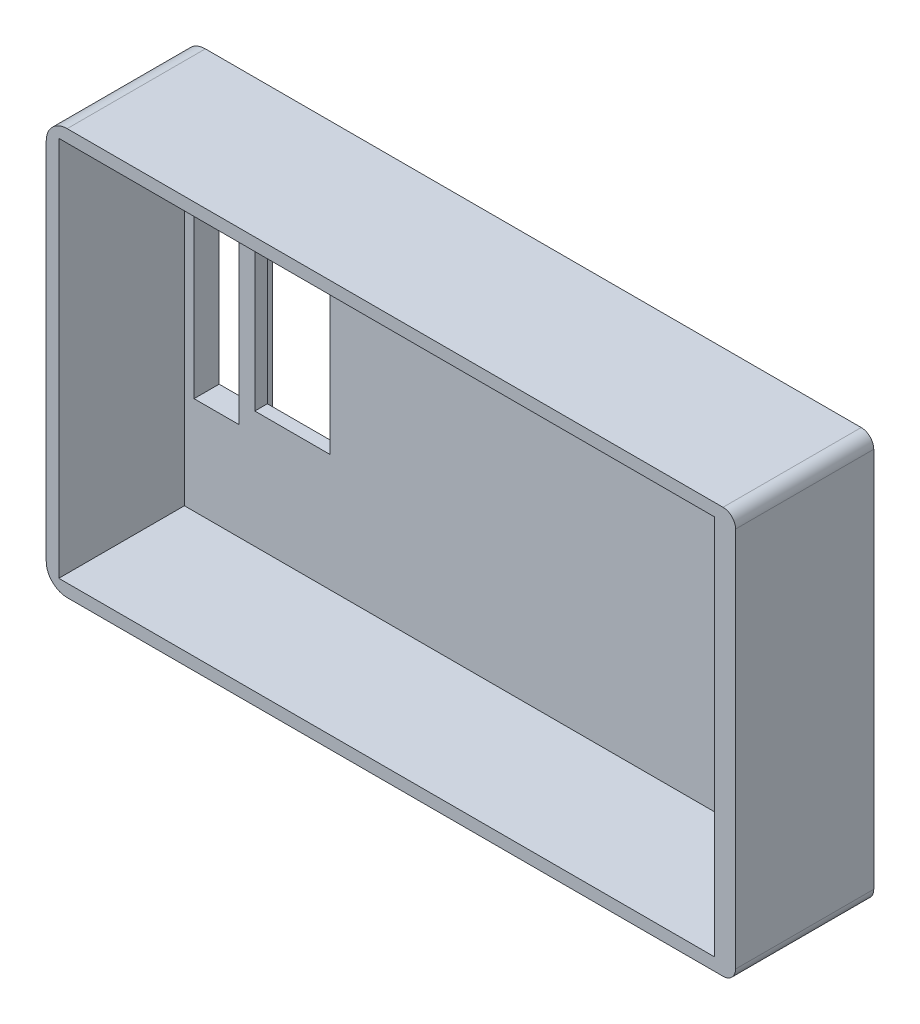
ISO-10303-21;
HEADER;
FILE_DESCRIPTION(('STEP AP214'),'2;1');
FILE_NAME('part.step','',(''),(''),'','','');
FILE_SCHEMA(('AUTOMOTIVE_DESIGN { 1 0 10303 214 1 1 1 1 }'));
ENDSEC;
DATA;
#1=APPLICATION_CONTEXT('core data for automotive mechanical design processes');
#2=APPLICATION_PROTOCOL_DEFINITION('international standard','automotive_design',2000,#1);
#3=PRODUCT_CONTEXT('',#1,'mechanical');
#4=PRODUCT('Part','Part','',(#3));
#5=PRODUCT_RELATED_PRODUCT_CATEGORY('part','',(#4));
#6=PRODUCT_DEFINITION_FORMATION('','',#4);
#7=PRODUCT_DEFINITION_CONTEXT('part definition',#1,'design');
#8=PRODUCT_DEFINITION('design','',#6,#7);
#9=PRODUCT_DEFINITION_SHAPE('','',#8);
#10=(LENGTH_UNIT() NAMED_UNIT(*) SI_UNIT(.MILLI.,.METRE.));
#11=(NAMED_UNIT(*) PLANE_ANGLE_UNIT() SI_UNIT($,.RADIAN.));
#12=(NAMED_UNIT(*) SI_UNIT($,.STERADIAN.) SOLID_ANGLE_UNIT());
#13=UNCERTAINTY_MEASURE_WITH_UNIT(LENGTH_MEASURE(1.E-05),#10,'distance_accuracy_value','');
#14=(GEOMETRIC_REPRESENTATION_CONTEXT(3) GLOBAL_UNCERTAINTY_ASSIGNED_CONTEXT((#13)) GLOBAL_UNIT_ASSIGNED_CONTEXT((#10,
#11,#12)) REPRESENTATION_CONTEXT('',''));
#15=CARTESIAN_POINT('',(0.,0.,0.));
#16=DIRECTION('',(0.,0.,1.));
#17=DIRECTION('',(1.,0.,0.));
#18=AXIS2_PLACEMENT_3D('',#15,#16,#17);
#19=CARTESIAN_POINT('',(0.,0.,3.));
#20=DIRECTION('',(0.,0.,1.));
#21=DIRECTION('',(1.,0.,0.));
#22=AXIS2_PLACEMENT_3D('',#19,#20,#21);
#23=PLANE('',#22);
#24=DIRECTION('',(-1.,0.,0.));
#25=VECTOR('',#24,1.);
#26=CARTESIAN_POINT('',(-55.8,70.7,3.));
#27=LINE('',#26,#25);
#28=CARTESIAN_POINT('',(-55.8,70.7,3.));
#29=VERTEX_POINT('',#28);
#30=CARTESIAN_POINT('',(-66.5142757664545,70.7,3.));
#31=VERTEX_POINT('',#30);
#32=EDGE_CURVE('E276',#29,#31,#27,.T.);
#33=ORIENTED_EDGE('',*,*,#32,.F.);
#34=DIRECTION('',(0.,1.,0.));
#35=VECTOR('',#34,1.);
#36=CARTESIAN_POINT('',(-55.8,26.3,3.));
#37=LINE('',#36,#35);
#38=CARTESIAN_POINT('',(-55.8,26.3,3.));
#39=VERTEX_POINT('',#38);
#40=EDGE_CURVE('E273',#39,#29,#37,.T.);
#41=ORIENTED_EDGE('',*,*,#40,.F.);
#42=DIRECTION('',(1.,0.,0.));
#43=VECTOR('',#42,1.);
#44=CARTESIAN_POINT('',(-55.8,26.3,3.));
#45=LINE('',#44,#43);
#46=CARTESIAN_POINT('',(-66.5142757664545,26.3,3.));
#47=VERTEX_POINT('',#46);
#48=EDGE_CURVE('E282',#47,#39,#45,.T.);
#49=ORIENTED_EDGE('',*,*,#48,.F.);
#50=DIRECTION('',(0.,-1.,0.));
#51=VECTOR('',#50,1.);
#52=CARTESIAN_POINT('',(-66.5142757664545,26.3,3.));
#53=LINE('',#52,#51);
#54=EDGE_CURVE('E279',#31,#47,#53,.T.);
#55=ORIENTED_EDGE('',*,*,#54,.F.);
#56=EDGE_LOOP('',(#33,#41,#49,#55));
#57=FACE_BOUND('',#56,.T.);
#58=DIRECTION('',(1.,0.,0.));
#59=VECTOR('',#58,1.);
#60=CARTESIAN_POINT('',(-52.,31.,3.));
#61=LINE('',#60,#59);
#62=CARTESIAN_POINT('',(-52.,31.,3.));
#63=VERTEX_POINT('',#62);
#64=CARTESIAN_POINT('',(-34.0355361729425,31.,3.));
#65=VERTEX_POINT('',#64);
#66=EDGE_CURVE('E288',#63,#65,#61,.T.);
#67=ORIENTED_EDGE('',*,*,#66,.F.);
#68=DIRECTION('',(0.,-1.,0.));
#69=VECTOR('',#68,1.);
#70=CARTESIAN_POINT('',(-52.,31.,3.));
#71=LINE('',#70,#69);
#72=CARTESIAN_POINT('',(-52.,66.,3.));
#73=VERTEX_POINT('',#72);
#74=EDGE_CURVE('E286',#73,#63,#71,.T.);
#75=ORIENTED_EDGE('',*,*,#74,.F.);
#76=DIRECTION('',(-1.,0.,0.));
#77=VECTOR('',#76,1.);
#78=CARTESIAN_POINT('',(-52.,66.,3.));
#79=LINE('',#78,#77);
#80=CARTESIAN_POINT('',(-34.0355361729425,66.,3.));
#81=VERTEX_POINT('',#80);
#82=EDGE_CURVE('E294',#81,#73,#79,.T.);
#83=ORIENTED_EDGE('',*,*,#82,.F.);
#84=DIRECTION('',(0.,1.,0.));
#85=VECTOR('',#84,1.);
#86=CARTESIAN_POINT('',(-34.0355361729425,31.,3.));
#87=LINE('',#86,#85);
#88=EDGE_CURVE('E291',#65,#81,#87,.T.);
#89=ORIENTED_EDGE('',*,*,#88,.F.);
#90=EDGE_LOOP('',(#67,#75,#83,#89));
#91=FACE_BOUND('',#90,.T.);
#92=DIRECTION('',(1.,0.,0.));
#93=VECTOR('',#92,1.);
#94=CARTESIAN_POINT('',(68.8142757664546,3.,3.));
#95=LINE('',#94,#93);
#96=CARTESIAN_POINT('',(-68.8142757664545,2.99999999999998,3.));
#97=VERTEX_POINT('',#96);
#98=CARTESIAN_POINT('',(87.8142757664545,3.,3.));
#99=VERTEX_POINT('',#98);
#100=EDGE_CURVE('E247',#97,#99,#95,.T.);
#101=ORIENTED_EDGE('',*,*,#100,.T.);
#102=DIRECTION('',(0.,-1.,0.));
#103=VECTOR('',#102,1.);
#104=CARTESIAN_POINT('',(87.8142757664545,3.,3.));
#105=LINE('',#104,#103);
#106=CARTESIAN_POINT('',(87.8142757664545,94.,3.));
#107=VERTEX_POINT('',#106);
#108=EDGE_CURVE('E232',#107,#99,#105,.T.);
#109=ORIENTED_EDGE('',*,*,#108,.F.);
#110=DIRECTION('',(-1.,0.,0.));
#111=VECTOR('',#110,1.);
#112=CARTESIAN_POINT('',(68.8142757664546,94.,3.));
#113=LINE('',#112,#111);
#114=CARTESIAN_POINT('',(-68.8142757664545,94.,3.));
#115=VERTEX_POINT('',#114);
#116=EDGE_CURVE('E240',#107,#115,#113,.T.);
#117=ORIENTED_EDGE('',*,*,#116,.T.);
#118=DIRECTION('',(0.,-1.,0.));
#119=VECTOR('',#118,1.);
#120=CARTESIAN_POINT('',(-68.8142757664545,2.99999999999998,3.));
#121=LINE('',#120,#119);
#122=EDGE_CURVE('E252',#115,#97,#121,.T.);
#123=ORIENTED_EDGE('',*,*,#122,.T.);
#124=EDGE_LOOP('',(#101,#109,#117,#123));
#125=FACE_BOUND('',#124,.T.);
#126=ADVANCED_FACE('F36',(#57,#91,#125),#23,.T.);
#127=CARTESIAN_POINT('',(68.8142757664546,94.,33.));
#128=DIRECTION('',(0.,-1.,0.));
#129=DIRECTION('',(1.,0.,0.));
#130=AXIS2_PLACEMENT_3D('',#127,#128,#129);
#131=PLANE('',#130);
#132=ORIENTED_EDGE('',*,*,#116,.F.);
#133=DIRECTION('',(0.,0.,-1.));
#134=VECTOR('',#133,1.);
#135=CARTESIAN_POINT('',(87.8142757664545,94.,33.));
#136=LINE('',#135,#134);
#137=CARTESIAN_POINT('',(87.8142757664545,94.,33.));
#138=VERTEX_POINT('',#137);
#139=EDGE_CURVE('E224',#138,#107,#136,.T.);
#140=ORIENTED_EDGE('',*,*,#139,.F.);
#141=DIRECTION('',(-1.,0.,0.));
#142=VECTOR('',#141,1.);
#143=CARTESIAN_POINT('',(68.8142757664546,94.,33.));
#144=LINE('',#143,#142);
#145=CARTESIAN_POINT('',(-68.8142757664545,94.,33.));
#146=VERTEX_POINT('',#145);
#147=EDGE_CURVE('E238',#138,#146,#144,.T.);
#148=ORIENTED_EDGE('',*,*,#147,.T.);
#149=DIRECTION('',(0.,0.,-1.));
#150=VECTOR('',#149,1.);
#151=CARTESIAN_POINT('',(-68.8142757664545,94.,33.));
#152=LINE('',#151,#150);
#153=EDGE_CURVE('E264',#146,#115,#152,.T.);
#154=ORIENTED_EDGE('',*,*,#153,.T.);
#155=EDGE_LOOP('',(#132,#140,#148,#154));
#156=FACE_BOUND('',#155,.T.);
#157=ADVANCED_FACE('F236',(#156),#131,.T.);
#158=CARTESIAN_POINT('',(68.8142757664546,3.,33.));
#159=DIRECTION('',(0.,1.,0.));
#160=DIRECTION('',(-1.,0.,0.));
#161=AXIS2_PLACEMENT_3D('',#158,#159,#160);
#162=PLANE('',#161);
#163=DIRECTION('',(1.,0.,0.));
#164=VECTOR('',#163,1.);
#165=CARTESIAN_POINT('',(68.8142757664546,3.,33.));
#166=LINE('',#165,#164);
#167=CARTESIAN_POINT('',(-68.8142757664545,2.99999999999998,33.));
#168=VERTEX_POINT('',#167);
#169=CARTESIAN_POINT('',(87.8142757664545,3.,33.));
#170=VERTEX_POINT('',#169);
#171=EDGE_CURVE('E249',#168,#170,#166,.T.);
#172=ORIENTED_EDGE('',*,*,#171,.T.);
#173=DIRECTION('',(0.,0.,-1.));
#174=VECTOR('',#173,1.);
#175=CARTESIAN_POINT('',(87.8142757664545,3.,33.));
#176=LINE('',#175,#174);
#177=EDGE_CURVE('E227',#170,#99,#176,.T.);
#178=ORIENTED_EDGE('',*,*,#177,.T.);
#179=ORIENTED_EDGE('',*,*,#100,.F.);
#180=DIRECTION('',(0.,0.,-1.));
#181=VECTOR('',#180,1.);
#182=CARTESIAN_POINT('',(-68.8142757664545,2.99999999999998,33.));
#183=LINE('',#182,#181);
#184=EDGE_CURVE('E259',#168,#97,#183,.T.);
#185=ORIENTED_EDGE('',*,*,#184,.F.);
#186=EDGE_LOOP('',(#172,#178,#179,#185));
#187=FACE_BOUND('',#186,.T.);
#188=ADVANCED_FACE('F484',(#187),#162,.T.);
#189=CARTESIAN_POINT('',(0.,0.,0.));
#190=DIRECTION('',(0.,0.,1.));
#191=DIRECTION('',(1.,0.,0.));
#192=AXIS2_PLACEMENT_3D('',#189,#190,#191);
#193=PLANE('',#192);
#194=DIRECTION('',(0.,-1.,0.));
#195=VECTOR('',#194,1.);
#196=CARTESIAN_POINT('',(-52.,31.,0.));
#197=LINE('',#196,#195);
#198=CARTESIAN_POINT('',(-52.,66.,0.));
#199=VERTEX_POINT('',#198);
#200=CARTESIAN_POINT('',(-52.,31.,0.));
#201=VERTEX_POINT('',#200);
#202=EDGE_CURVE('E285',#199,#201,#197,.T.);
#203=ORIENTED_EDGE('',*,*,#202,.T.);
#204=DIRECTION('',(1.,0.,0.));
#205=VECTOR('',#204,1.);
#206=CARTESIAN_POINT('',(-52.,31.,0.));
#207=LINE('',#206,#205);
#208=CARTESIAN_POINT('',(-34.0355361729425,31.,0.));
#209=VERTEX_POINT('',#208);
#210=EDGE_CURVE('E299',#201,#209,#207,.T.);
#211=ORIENTED_EDGE('',*,*,#210,.T.);
#212=DIRECTION('',(0.,1.,0.));
#213=VECTOR('',#212,1.);
#214=CARTESIAN_POINT('',(-34.0355361729425,31.,0.));
#215=LINE('',#214,#213);
#216=CARTESIAN_POINT('',(-34.0355361729425,66.,0.));
#217=VERTEX_POINT('',#216);
#218=EDGE_CURVE('E302',#209,#217,#215,.T.);
#219=ORIENTED_EDGE('',*,*,#218,.T.);
#220=DIRECTION('',(-1.,0.,0.));
#221=VECTOR('',#220,1.);
#222=CARTESIAN_POINT('',(-52.,66.,0.));
#223=LINE('',#222,#221);
#224=EDGE_CURVE('E289',#217,#199,#223,.T.);
#225=ORIENTED_EDGE('',*,*,#224,.T.);
#226=EDGE_LOOP('',(#203,#211,#219,#225));
#227=FACE_BOUND('',#226,.T.);
#228=CARTESIAN_POINT('',(-54.8,71.7,0.));
#229=DIRECTION('',(0.,0.,1.));
#230=DIRECTION('',(1.,0.,0.));
#231=AXIS2_PLACEMENT_3D('',#228,#229,#230);
#232=CIRCLE('',#231,0.999999999999994);
#233=CARTESIAN_POINT('',(-54.8,72.7,0.));
#234=VERTEX_POINT('',#233);
#235=CARTESIAN_POINT('',(-53.8,71.7,0.));
#236=VERTEX_POINT('',#235);
#237=EDGE_CURVE('E323',#234,#236,#232,.F.);
#238=ORIENTED_EDGE('',*,*,#237,.F.);
#239=DIRECTION('',(1.,0.,0.));
#240=VECTOR('',#239,1.);
#241=CARTESIAN_POINT('',(0.,72.7,0.));
#242=LINE('',#241,#240);
#243=CARTESIAN_POINT('',(-67.5142757664545,72.7,0.));
#244=VERTEX_POINT('',#243);
#245=EDGE_CURVE('E358',#244,#234,#242,.T.);
#246=ORIENTED_EDGE('',*,*,#245,.F.);
#247=CARTESIAN_POINT('',(-67.5142757664545,71.7,0.));
#248=DIRECTION('',(0.,0.,1.));
#249=DIRECTION('',(1.,0.,0.));
#250=AXIS2_PLACEMENT_3D('',#247,#248,#249);
#251=CIRCLE('',#250,1.);
#252=CARTESIAN_POINT('',(-68.5142757664546,71.7,0.));
#253=VERTEX_POINT('',#252);
#254=EDGE_CURVE('E360',#244,#253,#251,.T.);
#255=ORIENTED_EDGE('',*,*,#254,.T.);
#256=DIRECTION('',(0.,1.,0.));
#257=VECTOR('',#256,1.);
#258=CARTESIAN_POINT('',(-68.5142757664545,0.,0.));
#259=LINE('',#258,#257);
#260=CARTESIAN_POINT('',(-68.5142757664545,25.3,0.));
#261=VERTEX_POINT('',#260);
#262=EDGE_CURVE('E363',#261,#253,#259,.T.);
#263=ORIENTED_EDGE('',*,*,#262,.F.);
#264=CARTESIAN_POINT('',(-67.5142757664545,25.3,0.));
#265=DIRECTION('',(0.,0.,1.));
#266=DIRECTION('',(1.,0.,0.));
#267=AXIS2_PLACEMENT_3D('',#264,#265,#266);
#268=CIRCLE('',#267,1.);
#269=CARTESIAN_POINT('',(-67.5142757664545,24.3,0.));
#270=VERTEX_POINT('',#269);
#271=EDGE_CURVE('E366',#261,#270,#268,.T.);
#272=ORIENTED_EDGE('',*,*,#271,.T.);
#273=DIRECTION('',(1.,0.,0.));
#274=VECTOR('',#273,1.);
#275=CARTESIAN_POINT('',(0.,24.3,0.));
#276=LINE('',#275,#274);
#277=CARTESIAN_POINT('',(-54.8,24.3,0.));
#278=VERTEX_POINT('',#277);
#279=EDGE_CURVE('E369',#270,#278,#276,.T.);
#280=ORIENTED_EDGE('',*,*,#279,.T.);
#281=CARTESIAN_POINT('',(-54.8,25.3,0.));
#282=DIRECTION('',(0.,0.,1.));
#283=DIRECTION('',(1.,0.,0.));
#284=AXIS2_PLACEMENT_3D('',#281,#282,#283);
#285=CIRCLE('',#284,0.999999999999997);
#286=CARTESIAN_POINT('',(-53.8,25.3,0.));
#287=VERTEX_POINT('',#286);
#288=EDGE_CURVE('E372',#287,#278,#285,.F.);
#289=ORIENTED_EDGE('',*,*,#288,.F.);
#290=DIRECTION('',(0.,1.,0.));
#291=VECTOR('',#290,1.);
#292=CARTESIAN_POINT('',(-53.8,0.,0.));
#293=LINE('',#292,#291);
#294=EDGE_CURVE('E327',#287,#236,#293,.T.);
#295=ORIENTED_EDGE('',*,*,#294,.T.);
#296=EDGE_LOOP('',(#238,#246,#255,#263,#272,#280,#289,#295));
#297=FACE_BOUND('',#296,.T.);
#298=DIRECTION('',(0.,1.,0.));
#299=VECTOR('',#298,1.);
#300=CARTESIAN_POINT('',(92.8142757664546,0.,0.));
#301=LINE('',#300,#299);
#302=CARTESIAN_POINT('',(92.8142757664546,2.99999999999999,0.));
#303=VERTEX_POINT('',#302);
#304=CARTESIAN_POINT('',(92.8142757664546,94.,0.));
#305=VERTEX_POINT('',#304);
#306=EDGE_CURVE('E255',#303,#305,#301,.T.);
#307=ORIENTED_EDGE('',*,*,#306,.F.);
#308=CARTESIAN_POINT('',(89.8142757664546,2.99999999999999,0.));
#309=DIRECTION('',(0.,0.,1.));
#310=DIRECTION('',(1.,0.,0.));
#311=AXIS2_PLACEMENT_3D('',#308,#309,#310);
#312=CIRCLE('',#311,3.);
#313=CARTESIAN_POINT('',(89.8142757664546,0.,0.));
#314=VERTEX_POINT('',#313);
#315=EDGE_CURVE('E430',#303,#314,#312,.F.);
#316=ORIENTED_EDGE('',*,*,#315,.T.);
#317=DIRECTION('',(1.,0.,0.));
#318=VECTOR('',#317,1.);
#319=CARTESIAN_POINT('',(71.8142757664546,0.,0.));
#320=LINE('',#319,#318);
#321=CARTESIAN_POINT('',(-66.8142757664545,0.,0.));
#322=VERTEX_POINT('',#321);
#323=EDGE_CURVE('E321',#322,#314,#320,.T.);
#324=ORIENTED_EDGE('',*,*,#323,.F.);
#325=CARTESIAN_POINT('',(-66.8142757664545,4.99999999999999,0.));
#326=DIRECTION('',(0.,0.,1.));
#327=DIRECTION('',(1.,0.,0.));
#328=AXIS2_PLACEMENT_3D('',#325,#326,#327);
#329=CIRCLE('',#328,5.);
#330=CARTESIAN_POINT('',(-71.8142757664545,4.99999999999999,0.));
#331=VERTEX_POINT('',#330);
#332=EDGE_CURVE('E405',#322,#331,#329,.F.);
#333=ORIENTED_EDGE('',*,*,#332,.T.);
#334=DIRECTION('',(0.,-1.,0.));
#335=VECTOR('',#334,1.);
#336=CARTESIAN_POINT('',(-71.8142757664545,0.,0.));
#337=LINE('',#336,#335);
#338=CARTESIAN_POINT('',(-71.8142757664545,92.,0.));
#339=VERTEX_POINT('',#338);
#340=EDGE_CURVE('E318',#339,#331,#337,.T.);
#341=ORIENTED_EDGE('',*,*,#340,.F.);
#342=CARTESIAN_POINT('',(-66.8142757664545,92.,0.));
#343=DIRECTION('',(0.,0.,1.));
#344=DIRECTION('',(1.,0.,0.));
#345=AXIS2_PLACEMENT_3D('',#342,#343,#344);
#346=CIRCLE('',#345,5.);
#347=CARTESIAN_POINT('',(-66.8142757664545,97.,0.));
#348=VERTEX_POINT('',#347);
#349=EDGE_CURVE('E379',#339,#348,#346,.F.);
#350=ORIENTED_EDGE('',*,*,#349,.T.);
#351=DIRECTION('',(-1.,0.,0.));
#352=VECTOR('',#351,1.);
#353=CARTESIAN_POINT('',(71.8142757664546,97.,0.));
#354=LINE('',#353,#352);
#355=CARTESIAN_POINT('',(89.8142757664546,97.,0.));
#356=VERTEX_POINT('',#355);
#357=EDGE_CURVE('E316',#356,#348,#354,.T.);
#358=ORIENTED_EDGE('',*,*,#357,.F.);
#359=CARTESIAN_POINT('',(89.8142757664546,94.,0.));
#360=DIRECTION('',(0.,0.,1.));
#361=DIRECTION('',(1.,0.,0.));
#362=AXIS2_PLACEMENT_3D('',#359,#360,#361);
#363=CIRCLE('',#362,3.);
#364=EDGE_CURVE('E428',#356,#305,#363,.F.);
#365=ORIENTED_EDGE('',*,*,#364,.T.);
#366=EDGE_LOOP('',(#307,#316,#324,#333,#341,#350,#358,#365));
#367=FACE_BOUND('',#366,.T.);
#368=ADVANCED_FACE('F445',(#227,#297,#367),#193,.F.);
#369=CARTESIAN_POINT('',(0.,0.,33.));
#370=DIRECTION('',(0.,0.,1.));
#371=DIRECTION('',(1.,0.,0.));
#372=AXIS2_PLACEMENT_3D('',#369,#370,#371);
#373=PLANE('',#372);
#374=ORIENTED_EDGE('',*,*,#147,.F.);
#375=DIRECTION('',(0.,-1.,0.));
#376=VECTOR('',#375,1.);
#377=CARTESIAN_POINT('',(87.8142757664545,3.,33.));
#378=LINE('',#377,#376);
#379=EDGE_CURVE('E221',#138,#170,#378,.T.);
#380=ORIENTED_EDGE('',*,*,#379,.T.);
#381=ORIENTED_EDGE('',*,*,#171,.F.);
#382=DIRECTION('',(0.,-1.,0.));
#383=VECTOR('',#382,1.);
#384=CARTESIAN_POINT('',(-68.8142757664545,2.99999999999998,33.));
#385=LINE('',#384,#383);
#386=EDGE_CURVE('E246',#146,#168,#385,.T.);
#387=ORIENTED_EDGE('',*,*,#386,.F.);
#388=EDGE_LOOP('',(#374,#380,#381,#387));
#389=FACE_BOUND('',#388,.T.);
#390=DIRECTION('',(1.,0.,0.));
#391=VECTOR('',#390,1.);
#392=CARTESIAN_POINT('',(71.8142757664546,0.,33.));
#393=LINE('',#392,#391);
#394=CARTESIAN_POINT('',(-66.8142757664545,0.,33.));
#395=VERTEX_POINT('',#394);
#396=CARTESIAN_POINT('',(89.8142757664546,0.,33.));
#397=VERTEX_POINT('',#396);
#398=EDGE_CURVE('E271',#395,#397,#393,.T.);
#399=ORIENTED_EDGE('',*,*,#398,.T.);
#400=CARTESIAN_POINT('',(89.8142757664546,2.99999999999999,33.));
#401=DIRECTION('',(0.,0.,1.));
#402=DIRECTION('',(1.,0.,0.));
#403=AXIS2_PLACEMENT_3D('',#400,#401,#402);
#404=CIRCLE('',#403,3.);
#405=CARTESIAN_POINT('',(92.8142757664546,2.99999999999999,33.));
#406=VERTEX_POINT('',#405);
#407=EDGE_CURVE('E44',#397,#406,#404,.T.);
#408=ORIENTED_EDGE('',*,*,#407,.T.);
#409=DIRECTION('',(0.,-1.,0.));
#410=VECTOR('',#409,1.);
#411=CARTESIAN_POINT('',(92.8142757664546,3.,33.));
#412=LINE('',#411,#410);
#413=CARTESIAN_POINT('',(92.8142757664546,94.,33.));
#414=VERTEX_POINT('',#413);
#415=EDGE_CURVE('E241',#414,#406,#412,.T.);
#416=ORIENTED_EDGE('',*,*,#415,.F.);
#417=CARTESIAN_POINT('',(89.8142757664546,94.,33.));
#418=DIRECTION('',(0.,0.,1.));
#419=DIRECTION('',(1.,0.,0.));
#420=AXIS2_PLACEMENT_3D('',#417,#418,#419);
#421=CIRCLE('',#420,3.);
#422=CARTESIAN_POINT('',(89.8142757664546,97.,33.));
#423=VERTEX_POINT('',#422);
#424=EDGE_CURVE('E51',#414,#423,#421,.T.);
#425=ORIENTED_EDGE('',*,*,#424,.T.);
#426=DIRECTION('',(-1.,0.,0.));
#427=VECTOR('',#426,1.);
#428=CARTESIAN_POINT('',(71.8142757664546,97.,33.));
#429=LINE('',#428,#427);
#430=CARTESIAN_POINT('',(-66.8142757664545,97.,33.));
#431=VERTEX_POINT('',#430);
#432=EDGE_CURVE('E266',#423,#431,#429,.T.);
#433=ORIENTED_EDGE('',*,*,#432,.T.);
#434=CARTESIAN_POINT('',(-66.8142757664545,92.,33.));
#435=DIRECTION('',(0.,0.,1.));
#436=DIRECTION('',(1.,0.,0.));
#437=AXIS2_PLACEMENT_3D('',#434,#435,#436);
#438=CIRCLE('',#437,5.);
#439=CARTESIAN_POINT('',(-71.8142757664545,92.,33.));
#440=VERTEX_POINT('',#439);
#441=EDGE_CURVE('E410',#431,#440,#438,.T.);
#442=ORIENTED_EDGE('',*,*,#441,.T.);
#443=DIRECTION('',(0.,-1.,0.));
#444=VECTOR('',#443,1.);
#445=CARTESIAN_POINT('',(-71.8142757664545,0.,33.));
#446=LINE('',#445,#444);
#447=CARTESIAN_POINT('',(-71.8142757664545,4.99999999999999,33.));
#448=VERTEX_POINT('',#447);
#449=EDGE_CURVE('E268',#440,#448,#446,.T.);
#450=ORIENTED_EDGE('',*,*,#449,.T.);
#451=CARTESIAN_POINT('',(-66.8142757664545,4.99999999999999,33.));
#452=DIRECTION('',(0.,0.,1.));
#453=DIRECTION('',(1.,0.,0.));
#454=AXIS2_PLACEMENT_3D('',#451,#452,#453);
#455=CIRCLE('',#454,5.);
#456=EDGE_CURVE('E412',#448,#395,#455,.T.);
#457=ORIENTED_EDGE('',*,*,#456,.T.);
#458=EDGE_LOOP('',(#399,#408,#416,#425,#433,#442,#450,#457));
#459=FACE_BOUND('',#458,.T.);
#460=ADVANCED_FACE('F244',(#389,#459),#373,.T.);
#461=CARTESIAN_POINT('',(-66.5142757664545,0.,-3.));
#462=DIRECTION('',(-1.,0.,0.));
#463=DIRECTION('',(0.,-1.,0.));
#464=AXIS2_PLACEMENT_3D('',#461,#462,#463);
#465=PLANE('',#464);
#466=DIRECTION('',(0.,0.,1.));
#467=VECTOR('',#466,1.);
#468=CARTESIAN_POINT('',(-66.5142757664545,70.7,-3.));
#469=LINE('',#468,#467);
#470=CARTESIAN_POINT('',(-66.5142757664545,70.7,-3.));
#471=VERTEX_POINT('',#470);
#472=EDGE_CURVE('E384',#471,#31,#469,.T.);
#473=ORIENTED_EDGE('',*,*,#472,.T.);
#474=ORIENTED_EDGE('',*,*,#54,.T.);
#475=DIRECTION('',(0.,0.,1.));
#476=VECTOR('',#475,1.);
#477=CARTESIAN_POINT('',(-66.5142757664545,26.3,-3.));
#478=LINE('',#477,#476);
#479=CARTESIAN_POINT('',(-66.5142757664545,26.3,-3.));
#480=VERTEX_POINT('',#479);
#481=EDGE_CURVE('E377',#480,#47,#478,.T.);
#482=ORIENTED_EDGE('',*,*,#481,.F.);
#483=DIRECTION('',(0.,-1.,0.));
#484=VECTOR('',#483,1.);
#485=CARTESIAN_POINT('',(-66.5142757664545,0.,-3.));
#486=LINE('',#485,#484);
#487=EDGE_CURVE('E345',#471,#480,#486,.T.);
#488=ORIENTED_EDGE('',*,*,#487,.F.);
#489=EDGE_LOOP('',(#473,#474,#482,#488));
#490=FACE_BOUND('',#489,.T.);
#491=ADVANCED_FACE('F539',(#490),#465,.F.);
#492=CARTESIAN_POINT('',(0.,26.3,-3.));
#493=DIRECTION('',(0.,-1.,0.));
#494=DIRECTION('',(0.,0.,-1.));
#495=AXIS2_PLACEMENT_3D('',#492,#493,#494);
#496=PLANE('',#495);
#497=ORIENTED_EDGE('',*,*,#481,.T.);
#498=ORIENTED_EDGE('',*,*,#48,.T.);
#499=DIRECTION('',(0.,0.,1.));
#500=VECTOR('',#499,1.);
#501=CARTESIAN_POINT('',(-55.8,26.3,-3.));
#502=LINE('',#501,#500);
#503=CARTESIAN_POINT('',(-55.8,26.3,-3.));
#504=VERTEX_POINT('',#503);
#505=EDGE_CURVE('E380',#504,#39,#502,.T.);
#506=ORIENTED_EDGE('',*,*,#505,.F.);
#507=DIRECTION('',(1.,0.,0.));
#508=VECTOR('',#507,1.);
#509=CARTESIAN_POINT('',(0.,26.3,-3.));
#510=LINE('',#509,#508);
#511=EDGE_CURVE('E354',#480,#504,#510,.T.);
#512=ORIENTED_EDGE('',*,*,#511,.F.);
#513=EDGE_LOOP('',(#497,#498,#506,#512));
#514=FACE_BOUND('',#513,.T.);
#515=ADVANCED_FACE('F692',(#514),#496,.F.);
#516=CARTESIAN_POINT('',(-55.8,0.,-3.));
#517=DIRECTION('',(-1.,0.,0.));
#518=DIRECTION('',(0.,-1.,0.));
#519=AXIS2_PLACEMENT_3D('',#516,#517,#518);
#520=PLANE('',#519);
#521=ORIENTED_EDGE('',*,*,#505,.T.);
#522=ORIENTED_EDGE('',*,*,#40,.T.);
#523=DIRECTION('',(0.,0.,1.));
#524=VECTOR('',#523,1.);
#525=CARTESIAN_POINT('',(-55.8,70.7,-3.));
#526=LINE('',#525,#524);
#527=CARTESIAN_POINT('',(-55.8,70.7,-3.));
#528=VERTEX_POINT('',#527);
#529=EDGE_CURVE('E382',#528,#29,#526,.T.);
#530=ORIENTED_EDGE('',*,*,#529,.F.);
#531=DIRECTION('',(0.,-1.,0.));
#532=VECTOR('',#531,1.);
#533=CARTESIAN_POINT('',(-55.8,0.,-3.));
#534=LINE('',#533,#532);
#535=EDGE_CURVE('E351',#528,#504,#534,.T.);
#536=ORIENTED_EDGE('',*,*,#535,.T.);
#537=EDGE_LOOP('',(#521,#522,#530,#536));
#538=FACE_BOUND('',#537,.T.);
#539=ADVANCED_FACE('F662',(#538),#520,.T.);
#540=CARTESIAN_POINT('',(-54.8,71.7,-3.));
#541=DIRECTION('',(0.,0.,1.));
#542=DIRECTION('',(1.,0.,0.));
#543=AXIS2_PLACEMENT_3D('',#540,#541,#542);
#544=CYLINDRICAL_SURFACE('',#543,0.999999999999994);
#545=ORIENTED_EDGE('',*,*,#237,.T.);
#546=DIRECTION('',(0.,0.,1.));
#547=VECTOR('',#546,1.);
#548=CARTESIAN_POINT('',(-53.8,71.7,-3.));
#549=LINE('',#548,#547);
#550=CARTESIAN_POINT('',(-53.8,71.7,-3.));
#551=VERTEX_POINT('',#550);
#552=EDGE_CURVE('E386',#551,#236,#549,.T.);
#553=ORIENTED_EDGE('',*,*,#552,.F.);
#554=CARTESIAN_POINT('',(-54.8,71.7,-3.));
#555=DIRECTION('',(0.,0.,1.));
#556=DIRECTION('',(1.,0.,0.));
#557=AXIS2_PLACEMENT_3D('',#554,#555,#556);
#558=CIRCLE('',#557,0.999999999999994);
#559=CARTESIAN_POINT('',(-54.8,72.7,-3.));
#560=VERTEX_POINT('',#559);
#561=EDGE_CURVE('E324',#560,#551,#558,.F.);
#562=ORIENTED_EDGE('',*,*,#561,.F.);
#563=DIRECTION('',(0.,0.,1.));
#564=VECTOR('',#563,1.);
#565=CARTESIAN_POINT('',(-54.8,72.7,-3.));
#566=LINE('',#565,#564);
#567=EDGE_CURVE('E356',#560,#234,#566,.T.);
#568=ORIENTED_EDGE('',*,*,#567,.T.);
#569=EDGE_LOOP('',(#545,#553,#562,#568));
#570=FACE_BOUND('',#569,.T.);
#571=ADVANCED_FACE('F658',(#570),#544,.T.);
#572=CARTESIAN_POINT('',(-53.8,0.,-3.));
#573=DIRECTION('',(1.,0.,0.));
#574=DIRECTION('',(0.,0.,-1.));
#575=AXIS2_PLACEMENT_3D('',#572,#573,#574);
#576=PLANE('',#575);
#577=ORIENTED_EDGE('',*,*,#294,.F.);
#578=DIRECTION('',(0.,0.,1.));
#579=VECTOR('',#578,1.);
#580=CARTESIAN_POINT('',(-53.8,25.3,-3.));
#581=LINE('',#580,#579);
#582=CARTESIAN_POINT('',(-53.8,25.3,-3.));
#583=VERTEX_POINT('',#582);
#584=EDGE_CURVE('E389',#583,#287,#581,.T.);
#585=ORIENTED_EDGE('',*,*,#584,.F.);
#586=DIRECTION('',(0.,1.,0.));
#587=VECTOR('',#586,1.);
#588=CARTESIAN_POINT('',(-53.8,0.,-3.));
#589=LINE('',#588,#587);
#590=EDGE_CURVE('E342',#583,#551,#589,.T.);
#591=ORIENTED_EDGE('',*,*,#590,.T.);
#592=ORIENTED_EDGE('',*,*,#552,.T.);
#593=EDGE_LOOP('',(#577,#585,#591,#592));
#594=FACE_BOUND('',#593,.T.);
#595=ADVANCED_FACE('F661',(#594),#576,.T.);
#596=CARTESIAN_POINT('',(-54.8,25.3,-3.));
#597=DIRECTION('',(0.,0.,1.));
#598=DIRECTION('',(1.,0.,0.));
#599=AXIS2_PLACEMENT_3D('',#596,#597,#598);
#600=CYLINDRICAL_SURFACE('',#599,0.999999999999997);
#601=ORIENTED_EDGE('',*,*,#288,.T.);
#602=DIRECTION('',(0.,0.,1.));
#603=VECTOR('',#602,1.);
#604=CARTESIAN_POINT('',(-54.8,24.3,-3.));
#605=LINE('',#604,#603);
#606=CARTESIAN_POINT('',(-54.8,24.3,-3.));
#607=VERTEX_POINT('',#606);
#608=EDGE_CURVE('E391',#607,#278,#605,.T.);
#609=ORIENTED_EDGE('',*,*,#608,.F.);
#610=CARTESIAN_POINT('',(-54.8,25.3,-3.));
#611=DIRECTION('',(0.,0.,1.));
#612=DIRECTION('',(1.,0.,0.));
#613=AXIS2_PLACEMENT_3D('',#610,#611,#612);
#614=CIRCLE('',#613,0.999999999999997);
#615=EDGE_CURVE('E340',#583,#607,#614,.F.);
#616=ORIENTED_EDGE('',*,*,#615,.F.);
#617=ORIENTED_EDGE('',*,*,#584,.T.);
#618=EDGE_LOOP('',(#601,#609,#616,#617));
#619=FACE_BOUND('',#618,.T.);
#620=ADVANCED_FACE('F683',(#619),#600,.T.);
#621=CARTESIAN_POINT('',(0.,24.3,-3.));
#622=DIRECTION('',(0.,-1.,0.));
#623=DIRECTION('',(0.,0.,-1.));
#624=AXIS2_PLACEMENT_3D('',#621,#622,#623);
#625=PLANE('',#624);
#626=ORIENTED_EDGE('',*,*,#279,.F.);
#627=DIRECTION('',(0.,0.,1.));
#628=VECTOR('',#627,1.);
#629=CARTESIAN_POINT('',(-67.5142757664545,24.3,-3.));
#630=LINE('',#629,#628);
#631=CARTESIAN_POINT('',(-67.5142757664545,24.3,-3.));
#632=VERTEX_POINT('',#631);
#633=EDGE_CURVE('E393',#632,#270,#630,.T.);
#634=ORIENTED_EDGE('',*,*,#633,.F.);
#635=DIRECTION('',(1.,0.,0.));
#636=VECTOR('',#635,1.);
#637=CARTESIAN_POINT('',(0.,24.3,-3.));
#638=LINE('',#637,#636);
#639=EDGE_CURVE('E337',#632,#607,#638,.T.);
#640=ORIENTED_EDGE('',*,*,#639,.T.);
#641=ORIENTED_EDGE('',*,*,#608,.T.);
#642=EDGE_LOOP('',(#626,#634,#640,#641));
#643=FACE_BOUND('',#642,.T.);
#644=ADVANCED_FACE('F679',(#643),#625,.T.);
#645=CARTESIAN_POINT('',(-67.5142757664545,25.3,-3.));
#646=DIRECTION('',(0.,0.,1.));
#647=DIRECTION('',(1.,0.,0.));
#648=AXIS2_PLACEMENT_3D('',#645,#646,#647);
#649=CYLINDRICAL_SURFACE('',#648,1.);
#650=ORIENTED_EDGE('',*,*,#271,.F.);
#651=DIRECTION('',(0.,0.,1.));
#652=VECTOR('',#651,1.);
#653=CARTESIAN_POINT('',(-68.5142757664545,25.3,-3.));
#654=LINE('',#653,#652);
#655=CARTESIAN_POINT('',(-68.5142757664545,25.3,-3.));
#656=VERTEX_POINT('',#655);
#657=EDGE_CURVE('E395',#656,#261,#654,.T.);
#658=ORIENTED_EDGE('',*,*,#657,.F.);
#659=CARTESIAN_POINT('',(-67.5142757664545,25.3,-3.));
#660=DIRECTION('',(0.,0.,1.));
#661=DIRECTION('',(1.,0.,0.));
#662=AXIS2_PLACEMENT_3D('',#659,#660,#661);
#663=CIRCLE('',#662,1.);
#664=EDGE_CURVE('E334',#656,#632,#663,.T.);
#665=ORIENTED_EDGE('',*,*,#664,.T.);
#666=ORIENTED_EDGE('',*,*,#633,.T.);
#667=EDGE_LOOP('',(#650,#658,#665,#666));
#668=FACE_BOUND('',#667,.T.);
#669=ADVANCED_FACE('F675',(#668),#649,.T.);
#670=CARTESIAN_POINT('',(-68.5142757664545,0.,-3.));
#671=DIRECTION('',(1.,0.,0.));
#672=DIRECTION('',(0.,1.,0.));
#673=AXIS2_PLACEMENT_3D('',#670,#671,#672);
#674=PLANE('',#673);
#675=ORIENTED_EDGE('',*,*,#262,.T.);
#676=DIRECTION('',(0.,0.,1.));
#677=VECTOR('',#676,1.);
#678=CARTESIAN_POINT('',(-68.5142757664546,71.7,-3.));
#679=LINE('',#678,#677);
#680=CARTESIAN_POINT('',(-68.5142757664546,71.7,-3.));
#681=VERTEX_POINT('',#680);
#682=EDGE_CURVE('E397',#681,#253,#679,.T.);
#683=ORIENTED_EDGE('',*,*,#682,.F.);
#684=DIRECTION('',(0.,1.,0.));
#685=VECTOR('',#684,1.);
#686=CARTESIAN_POINT('',(-68.5142757664545,0.,-3.));
#687=LINE('',#686,#685);
#688=EDGE_CURVE('E332',#656,#681,#687,.T.);
#689=ORIENTED_EDGE('',*,*,#688,.F.);
#690=ORIENTED_EDGE('',*,*,#657,.T.);
#691=EDGE_LOOP('',(#675,#683,#689,#690));
#692=FACE_BOUND('',#691,.T.);
#693=ADVANCED_FACE('F671',(#692),#674,.F.);
#694=CARTESIAN_POINT('',(-67.5142757664545,71.7,-3.));
#695=DIRECTION('',(0.,0.,1.));
#696=DIRECTION('',(1.,0.,0.));
#697=AXIS2_PLACEMENT_3D('',#694,#695,#696);
#698=CYLINDRICAL_SURFACE('',#697,1.);
#699=ORIENTED_EDGE('',*,*,#254,.F.);
#700=DIRECTION('',(0.,0.,1.));
#701=VECTOR('',#700,1.);
#702=CARTESIAN_POINT('',(-67.5142757664545,72.7,-3.));
#703=LINE('',#702,#701);
#704=CARTESIAN_POINT('',(-67.5142757664545,72.7,-3.));
#705=VERTEX_POINT('',#704);
#706=EDGE_CURVE('E399',#705,#244,#703,.T.);
#707=ORIENTED_EDGE('',*,*,#706,.F.);
#708=CARTESIAN_POINT('',(-67.5142757664545,71.7,-3.));
#709=DIRECTION('',(0.,0.,1.));
#710=DIRECTION('',(1.,0.,0.));
#711=AXIS2_PLACEMENT_3D('',#708,#709,#710);
#712=CIRCLE('',#711,1.);
#713=EDGE_CURVE('E329',#705,#681,#712,.T.);
#714=ORIENTED_EDGE('',*,*,#713,.T.);
#715=ORIENTED_EDGE('',*,*,#682,.T.);
#716=EDGE_LOOP('',(#699,#707,#714,#715));
#717=FACE_BOUND('',#716,.T.);
#718=ADVANCED_FACE('F667',(#717),#698,.T.);
#719=CARTESIAN_POINT('',(0.,72.7,-3.));
#720=DIRECTION('',(0.,-1.,0.));
#721=DIRECTION('',(0.,0.,-1.));
#722=AXIS2_PLACEMENT_3D('',#719,#720,#721);
#723=PLANE('',#722);
#724=ORIENTED_EDGE('',*,*,#245,.T.);
#725=ORIENTED_EDGE('',*,*,#567,.F.);
#726=DIRECTION('',(1.,0.,0.));
#727=VECTOR('',#726,1.);
#728=CARTESIAN_POINT('',(0.,72.7,-3.));
#729=LINE('',#728,#727);
#730=EDGE_CURVE('E326',#705,#560,#729,.T.);
#731=ORIENTED_EDGE('',*,*,#730,.F.);
#732=ORIENTED_EDGE('',*,*,#706,.T.);
#733=EDGE_LOOP('',(#724,#725,#731,#732));
#734=FACE_BOUND('',#733,.T.);
#735=ADVANCED_FACE('F664',(#734),#723,.F.);
#736=CARTESIAN_POINT('',(0.,70.7,-3.));
#737=DIRECTION('',(0.,-1.,0.));
#738=DIRECTION('',(0.,0.,-1.));
#739=AXIS2_PLACEMENT_3D('',#736,#737,#738);
#740=PLANE('',#739);
#741=ORIENTED_EDGE('',*,*,#529,.T.);
#742=ORIENTED_EDGE('',*,*,#32,.T.);
#743=ORIENTED_EDGE('',*,*,#472,.F.);
#744=DIRECTION('',(1.,0.,0.));
#745=VECTOR('',#744,1.);
#746=CARTESIAN_POINT('',(0.,70.7,-3.));
#747=LINE('',#746,#745);
#748=EDGE_CURVE('E348',#471,#528,#747,.T.);
#749=ORIENTED_EDGE('',*,*,#748,.T.);
#750=EDGE_LOOP('',(#741,#742,#743,#749));
#751=FACE_BOUND('',#750,.T.);
#752=ADVANCED_FACE('F475',(#751),#740,.T.);
#753=CARTESIAN_POINT('',(0.,0.,-3.));
#754=DIRECTION('',(0.,0.,1.));
#755=DIRECTION('',(1.,0.,0.));
#756=AXIS2_PLACEMENT_3D('',#753,#754,#755);
#757=PLANE('',#756);
#758=ORIENTED_EDGE('',*,*,#561,.T.);
#759=ORIENTED_EDGE('',*,*,#590,.F.);
#760=ORIENTED_EDGE('',*,*,#615,.T.);
#761=ORIENTED_EDGE('',*,*,#639,.F.);
#762=ORIENTED_EDGE('',*,*,#664,.F.);
#763=ORIENTED_EDGE('',*,*,#688,.T.);
#764=ORIENTED_EDGE('',*,*,#713,.F.);
#765=ORIENTED_EDGE('',*,*,#730,.T.);
#766=EDGE_LOOP('',(#758,#759,#760,#761,#762,#763,#764,#765));
#767=FACE_BOUND('',#766,.T.);
#768=ORIENTED_EDGE('',*,*,#487,.T.);
#769=ORIENTED_EDGE('',*,*,#511,.T.);
#770=ORIENTED_EDGE('',*,*,#535,.F.);
#771=ORIENTED_EDGE('',*,*,#748,.F.);
#772=EDGE_LOOP('',(#768,#769,#770,#771));
#773=FACE_BOUND('',#772,.T.);
#774=ADVANCED_FACE('F468',(#767,#773),#757,.F.);
#775=CARTESIAN_POINT('',(71.8142757664546,97.,3.));
#776=DIRECTION('',(0.,-1.,0.));
#777=DIRECTION('',(0.,0.,-1.));
#778=AXIS2_PLACEMENT_3D('',#775,#776,#777);
#779=PLANE('',#778);
#780=ORIENTED_EDGE('',*,*,#432,.F.);
#781=DIRECTION('',(0.,0.,1.));
#782=VECTOR('',#781,1.);
#783=CARTESIAN_POINT('',(89.8142757664546,97.,0.));
#784=LINE('',#783,#782);
#785=EDGE_CURVE('E11',#423,#356,#784,.F.);
#786=ORIENTED_EDGE('',*,*,#785,.T.);
#787=ORIENTED_EDGE('',*,*,#357,.T.);
#788=DIRECTION('',(0.,0.,-1.));
#789=VECTOR('',#788,1.);
#790=CARTESIAN_POINT('',(-66.8142757664545,97.,3.));
#791=LINE('',#790,#789);
#792=EDGE_CURVE('E419',#348,#431,#791,.F.);
#793=ORIENTED_EDGE('',*,*,#792,.T.);
#794=EDGE_LOOP('',(#780,#786,#787,#793));
#795=FACE_BOUND('',#794,.T.);
#796=ADVANCED_FACE('F466',(#795),#779,.F.);
#797=CARTESIAN_POINT('',(-71.8142757664545,0.,3.));
#798=DIRECTION('',(1.,0.,0.));
#799=DIRECTION('',(0.,0.,-1.));
#800=AXIS2_PLACEMENT_3D('',#797,#798,#799);
#801=PLANE('',#800);
#802=ORIENTED_EDGE('',*,*,#340,.T.);
#803=DIRECTION('',(0.,0.,-1.));
#804=VECTOR('',#803,1.);
#805=CARTESIAN_POINT('',(-71.8142757664545,4.99999999999999,3.));
#806=LINE('',#805,#804);
#807=EDGE_CURVE('E417',#331,#448,#806,.F.);
#808=ORIENTED_EDGE('',*,*,#807,.T.);
#809=ORIENTED_EDGE('',*,*,#449,.F.);
#810=DIRECTION('',(0.,0.,-1.));
#811=VECTOR('',#810,1.);
#812=CARTESIAN_POINT('',(-71.8142757664545,92.,3.));
#813=LINE('',#812,#811);
#814=EDGE_CURVE('E414',#440,#339,#813,.T.);
#815=ORIENTED_EDGE('',*,*,#814,.T.);
#816=EDGE_LOOP('',(#802,#808,#809,#815));
#817=FACE_BOUND('',#816,.T.);
#818=ADVANCED_FACE('F454',(#817),#801,.F.);
#819=CARTESIAN_POINT('',(71.8142757664546,0.,3.));
#820=DIRECTION('',(0.,1.,0.));
#821=DIRECTION('',(0.,0.,1.));
#822=AXIS2_PLACEMENT_3D('',#819,#820,#821);
#823=PLANE('',#822);
#824=ORIENTED_EDGE('',*,*,#323,.T.);
#825=DIRECTION('',(0.,0.,-1.));
#826=VECTOR('',#825,1.);
#827=CARTESIAN_POINT('',(89.8142757664546,0.,33.));
#828=LINE('',#827,#826);
#829=EDGE_CURVE('E59',#314,#397,#828,.F.);
#830=ORIENTED_EDGE('',*,*,#829,.T.);
#831=ORIENTED_EDGE('',*,*,#398,.F.);
#832=DIRECTION('',(0.,0.,-1.));
#833=VECTOR('',#832,1.);
#834=CARTESIAN_POINT('',(-66.8142757664545,0.,3.));
#835=LINE('',#834,#833);
#836=EDGE_CURVE('E407',#395,#322,#835,.T.);
#837=ORIENTED_EDGE('',*,*,#836,.T.);
#838=EDGE_LOOP('',(#824,#830,#831,#837));
#839=FACE_BOUND('',#838,.T.);
#840=ADVANCED_FACE('F446',(#839),#823,.F.);
#841=CARTESIAN_POINT('',(-52.,31.,3.));
#842=DIRECTION('',(1.,0.,0.));
#843=DIRECTION('',(0.,0.,-1.));
#844=AXIS2_PLACEMENT_3D('',#841,#842,#843);
#845=PLANE('',#844);
#846=ORIENTED_EDGE('',*,*,#202,.F.);
#847=DIRECTION('',(0.,0.,-1.));
#848=VECTOR('',#847,1.);
#849=CARTESIAN_POINT('',(-52.,66.,3.));
#850=LINE('',#849,#848);
#851=EDGE_CURVE('E296',#73,#199,#850,.T.);
#852=ORIENTED_EDGE('',*,*,#851,.F.);
#853=ORIENTED_EDGE('',*,*,#74,.T.);
#854=DIRECTION('',(0.,0.,-1.));
#855=VECTOR('',#854,1.);
#856=CARTESIAN_POINT('',(-52.,31.,3.));
#857=LINE('',#856,#855);
#858=EDGE_CURVE('E313',#63,#201,#857,.T.);
#859=ORIENTED_EDGE('',*,*,#858,.T.);
#860=EDGE_LOOP('',(#846,#852,#853,#859));
#861=FACE_BOUND('',#860,.T.);
#862=ADVANCED_FACE('F490',(#861),#845,.T.);
#863=CARTESIAN_POINT('',(-52.,31.,3.));
#864=DIRECTION('',(0.,1.,0.));
#865=DIRECTION('',(0.,0.,1.));
#866=AXIS2_PLACEMENT_3D('',#863,#864,#865);
#867=PLANE('',#866);
#868=ORIENTED_EDGE('',*,*,#210,.F.);
#869=ORIENTED_EDGE('',*,*,#858,.F.);
#870=ORIENTED_EDGE('',*,*,#66,.T.);
#871=DIRECTION('',(0.,0.,-1.));
#872=VECTOR('',#871,1.);
#873=CARTESIAN_POINT('',(-34.0355361729425,31.,3.));
#874=LINE('',#873,#872);
#875=EDGE_CURVE('E311',#65,#209,#874,.T.);
#876=ORIENTED_EDGE('',*,*,#875,.T.);
#877=EDGE_LOOP('',(#868,#869,#870,#876));
#878=FACE_BOUND('',#877,.T.);
#879=ADVANCED_FACE('F499',(#878),#867,.T.);
#880=CARTESIAN_POINT('',(-34.0355361729425,31.,3.));
#881=DIRECTION('',(-1.,0.,0.));
#882=DIRECTION('',(0.,0.,1.));
#883=AXIS2_PLACEMENT_3D('',#880,#881,#882);
#884=PLANE('',#883);
#885=ORIENTED_EDGE('',*,*,#218,.F.);
#886=ORIENTED_EDGE('',*,*,#875,.F.);
#887=ORIENTED_EDGE('',*,*,#88,.T.);
#888=DIRECTION('',(0.,0.,-1.));
#889=VECTOR('',#888,1.);
#890=CARTESIAN_POINT('',(-34.0355361729425,66.,3.));
#891=LINE('',#890,#889);
#892=EDGE_CURVE('E309',#81,#217,#891,.T.);
#893=ORIENTED_EDGE('',*,*,#892,.T.);
#894=EDGE_LOOP('',(#885,#886,#887,#893));
#895=FACE_BOUND('',#894,.T.);
#896=ADVANCED_FACE('F504',(#895),#884,.T.);
#897=CARTESIAN_POINT('',(-52.,66.,3.));
#898=DIRECTION('',(0.,-1.,0.));
#899=DIRECTION('',(0.,0.,-1.));
#900=AXIS2_PLACEMENT_3D('',#897,#898,#899);
#901=PLANE('',#900);
#902=ORIENTED_EDGE('',*,*,#224,.F.);
#903=ORIENTED_EDGE('',*,*,#892,.F.);
#904=ORIENTED_EDGE('',*,*,#82,.T.);
#905=ORIENTED_EDGE('',*,*,#851,.T.);
#906=EDGE_LOOP('',(#902,#903,#904,#905));
#907=FACE_BOUND('',#906,.T.);
#908=ADVANCED_FACE('F511',(#907),#901,.T.);
#909=CARTESIAN_POINT('',(-68.8142757664545,2.99999999999998,33.));
#910=DIRECTION('',(1.,0.,0.));
#911=DIRECTION('',(0.,0.,-1.));
#912=AXIS2_PLACEMENT_3D('',#909,#910,#911);
#913=PLANE('',#912);
#914=ORIENTED_EDGE('',*,*,#122,.F.);
#915=ORIENTED_EDGE('',*,*,#153,.F.);
#916=ORIENTED_EDGE('',*,*,#386,.T.);
#917=ORIENTED_EDGE('',*,*,#184,.T.);
#918=EDGE_LOOP('',(#914,#915,#916,#917));
#919=FACE_BOUND('',#918,.T.);
#920=ADVANCED_FACE('F526',(#919),#913,.T.);
#921=CARTESIAN_POINT('',(-66.8142757664545,4.99999999999999,3.));
#922=DIRECTION('',(0.,0.,-1.));
#923=DIRECTION('',(-1.,0.,0.));
#924=AXIS2_PLACEMENT_3D('',#921,#922,#923);
#925=CYLINDRICAL_SURFACE('',#924,5.);
#926=ORIENTED_EDGE('',*,*,#456,.F.);
#927=ORIENTED_EDGE('',*,*,#807,.F.);
#928=ORIENTED_EDGE('',*,*,#332,.F.);
#929=ORIENTED_EDGE('',*,*,#836,.F.);
#930=EDGE_LOOP('',(#926,#927,#928,#929));
#931=FACE_BOUND('',#930,.T.);
#932=ADVANCED_FACE('F450',(#931),#925,.T.);
#933=CARTESIAN_POINT('',(-66.8142757664545,92.,3.));
#934=DIRECTION('',(0.,0.,-1.));
#935=DIRECTION('',(-1.,0.,0.));
#936=AXIS2_PLACEMENT_3D('',#933,#934,#935);
#937=CYLINDRICAL_SURFACE('',#936,5.);
#938=ORIENTED_EDGE('',*,*,#441,.F.);
#939=ORIENTED_EDGE('',*,*,#792,.F.);
#940=ORIENTED_EDGE('',*,*,#349,.F.);
#941=ORIENTED_EDGE('',*,*,#814,.F.);
#942=EDGE_LOOP('',(#938,#939,#940,#941));
#943=FACE_BOUND('',#942,.T.);
#944=ADVANCED_FACE('F459',(#943),#937,.T.);
#945=CARTESIAN_POINT('',(92.8142757664546,0.,0.));
#946=DIRECTION('',(1.,0.,0.));
#947=DIRECTION('',(0.,0.,-1.));
#948=AXIS2_PLACEMENT_3D('',#945,#946,#947);
#949=PLANE('',#948);
#950=ORIENTED_EDGE('',*,*,#415,.T.);
#951=DIRECTION('',(0.,0.,-1.));
#952=VECTOR('',#951,1.);
#953=CARTESIAN_POINT('',(92.8142757664546,2.99999999999999,0.));
#954=LINE('',#953,#952);
#955=EDGE_CURVE('E425',#406,#303,#954,.T.);
#956=ORIENTED_EDGE('',*,*,#955,.T.);
#957=ORIENTED_EDGE('',*,*,#306,.T.);
#958=DIRECTION('',(0.,0.,1.));
#959=VECTOR('',#958,1.);
#960=CARTESIAN_POINT('',(92.8142757664546,94.,33.));
#961=LINE('',#960,#959);
#962=EDGE_CURVE('E422',#305,#414,#961,.T.);
#963=ORIENTED_EDGE('',*,*,#962,.T.);
#964=EDGE_LOOP('',(#950,#956,#957,#963));
#965=FACE_BOUND('',#964,.T.);
#966=ADVANCED_FACE('F438',(#965),#949,.T.);
#967=CARTESIAN_POINT('',(87.8142757664545,3.,33.));
#968=DIRECTION('',(1.,0.,0.));
#969=DIRECTION('',(0.,0.,-1.));
#970=AXIS2_PLACEMENT_3D('',#967,#968,#969);
#971=PLANE('',#970);
#972=ORIENTED_EDGE('',*,*,#108,.T.);
#973=ORIENTED_EDGE('',*,*,#177,.F.);
#974=ORIENTED_EDGE('',*,*,#379,.F.);
#975=ORIENTED_EDGE('',*,*,#139,.T.);
#976=EDGE_LOOP('',(#972,#973,#974,#975));
#977=FACE_BOUND('',#976,.T.);
#978=ADVANCED_FACE('F223',(#977),#971,.F.);
#979=CARTESIAN_POINT('',(89.8142757664546,2.99999999999999,0.));
#980=DIRECTION('',(0.,0.,1.));
#981=DIRECTION('',(1.,0.,0.));
#982=AXIS2_PLACEMENT_3D('',#979,#980,#981);
#983=CYLINDRICAL_SURFACE('',#982,3.);
#984=ORIENTED_EDGE('',*,*,#407,.F.);
#985=ORIENTED_EDGE('',*,*,#829,.F.);
#986=ORIENTED_EDGE('',*,*,#315,.F.);
#987=ORIENTED_EDGE('',*,*,#955,.F.);
#988=EDGE_LOOP('',(#984,#985,#986,#987));
#989=FACE_BOUND('',#988,.T.);
#990=ADVANCED_FACE('F442',(#989),#983,.T.);
#991=CARTESIAN_POINT('',(89.8142757664546,94.,0.));
#992=DIRECTION('',(0.,0.,-1.));
#993=DIRECTION('',(-1.,0.,0.));
#994=AXIS2_PLACEMENT_3D('',#991,#992,#993);
#995=CYLINDRICAL_SURFACE('',#994,3.);
#996=ORIENTED_EDGE('',*,*,#364,.F.);
#997=ORIENTED_EDGE('',*,*,#785,.F.);
#998=ORIENTED_EDGE('',*,*,#424,.F.);
#999=ORIENTED_EDGE('',*,*,#962,.F.);
#1000=EDGE_LOOP('',(#996,#997,#998,#999));
#1001=FACE_BOUND('',#1000,.T.);
#1002=ADVANCED_FACE('F38',(#1001),#995,.T.);
#1003=CLOSED_SHELL('',(#126,#157,#188,#368,#460,#491,#515,#539,#571,#595,#620,#644,#669,#693,
#718,#735,#752,#774,#796,#818,#840,#862,#879,#896,#908,#920,#932,#944,#966,#978,#990,#1002));
#1004=MANIFOLD_SOLID_BREP('B2',#1003);
#1005=ADVANCED_BREP_SHAPE_REPRESENTATION('',(#18,#1004),#14);
#1006=SHAPE_DEFINITION_REPRESENTATION(#9,#1005);
ENDSEC;
END-ISO-10303-21;
